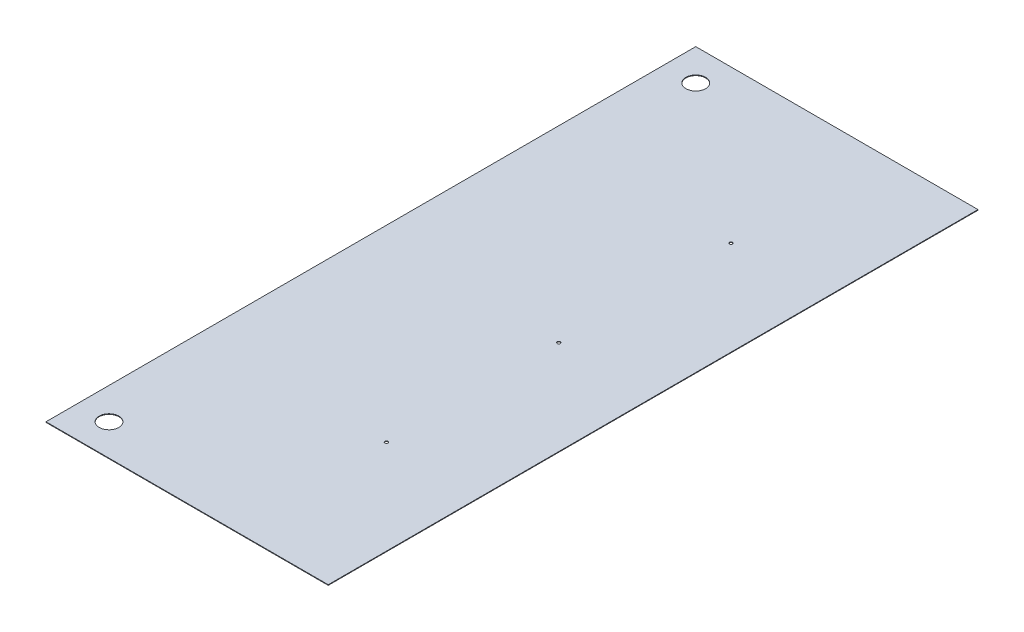
ISO-10303-21;
HEADER;
FILE_DESCRIPTION(('STEP AP214'),'2;1');
FILE_NAME('part.step','',(''),(''),'','','');
FILE_SCHEMA(('AUTOMOTIVE_DESIGN { 1 0 10303 214 1 1 1 1 }'));
ENDSEC;
DATA;
#1=APPLICATION_CONTEXT('core data for automotive mechanical design processes');
#2=APPLICATION_PROTOCOL_DEFINITION('international standard','automotive_design',2000,#1);
#3=PRODUCT_CONTEXT('',#1,'mechanical');
#4=PRODUCT('Part','Part','',(#3));
#5=PRODUCT_RELATED_PRODUCT_CATEGORY('part','',(#4));
#6=PRODUCT_DEFINITION_FORMATION('','',#4);
#7=PRODUCT_DEFINITION_CONTEXT('part definition',#1,'design');
#8=PRODUCT_DEFINITION('design','',#6,#7);
#9=PRODUCT_DEFINITION_SHAPE('','',#8);
#10=(LENGTH_UNIT() NAMED_UNIT(*) SI_UNIT(.MILLI.,.METRE.));
#11=(NAMED_UNIT(*) PLANE_ANGLE_UNIT() SI_UNIT($,.RADIAN.));
#12=(NAMED_UNIT(*) SI_UNIT($,.STERADIAN.) SOLID_ANGLE_UNIT());
#13=UNCERTAINTY_MEASURE_WITH_UNIT(LENGTH_MEASURE(1.E-05),#10,'distance_accuracy_value','');
#14=(GEOMETRIC_REPRESENTATION_CONTEXT(3) GLOBAL_UNCERTAINTY_ASSIGNED_CONTEXT((#13)) GLOBAL_UNIT_ASSIGNED_CONTEXT((#10,
#11,#12)) REPRESENTATION_CONTEXT('',''));
#15=CARTESIAN_POINT('',(0.,0.,0.));
#16=DIRECTION('',(0.,0.,1.));
#17=DIRECTION('',(1.,0.,0.));
#18=AXIS2_PLACEMENT_3D('',#15,#16,#17);
#19=CARTESIAN_POINT('',(0.,100.,0.));
#20=DIRECTION('',(0.,1.,0.));
#21=DIRECTION('',(0.,0.,1.));
#22=AXIS2_PLACEMENT_3D('',#19,#20,#21);
#23=PLANE('',#22);
#24=CARTESIAN_POINT('',(-1095.,100.,745.));
#25=DIRECTION('',(0.,1.,0.));
#26=DIRECTION('',(0.,0.,1.));
#27=AXIS2_PLACEMENT_3D('',#24,#25,#26);
#28=CIRCLE('',#27,25.);
#29=CARTESIAN_POINT('',(-1095.,100.,770.));
#30=VERTEX_POINT('',#29);
#31=EDGE_CURVE('E94',#30,#30,#28,.F.);
#32=ORIENTED_EDGE('',*,*,#31,.T.);
#33=EDGE_LOOP('',(#32));
#34=FACE_BOUND('',#33,.T.);
#35=CARTESIAN_POINT('',(-1095.,100.,-745.));
#36=DIRECTION('',(0.,1.,0.));
#37=DIRECTION('',(0.,0.,1.));
#38=AXIS2_PLACEMENT_3D('',#35,#36,#37);
#39=CIRCLE('',#38,25.);
#40=CARTESIAN_POINT('',(-1095.,100.,-720.));
#41=VERTEX_POINT('',#40);
#42=EDGE_CURVE('E97',#41,#41,#39,.F.);
#43=ORIENTED_EDGE('',*,*,#42,.T.);
#44=EDGE_LOOP('',(#43));
#45=FACE_BOUND('',#44,.T.);
#46=CARTESIAN_POINT('',(-698.,100.,-437.5));
#47=DIRECTION('',(0.,1.,0.));
#48=DIRECTION('',(0.,0.,1.));
#49=AXIS2_PLACEMENT_3D('',#46,#47,#48);
#50=CIRCLE('',#49,4.);
#51=CARTESIAN_POINT('',(-698.,100.,-433.5));
#52=VERTEX_POINT('',#51);
#53=EDGE_CURVE('E100',#52,#52,#50,.F.);
#54=ORIENTED_EDGE('',*,*,#53,.T.);
#55=EDGE_LOOP('',(#54));
#56=FACE_BOUND('',#55,.T.);
#57=CARTESIAN_POINT('',(-698.,100.,0.));
#58=DIRECTION('',(0.,1.,0.));
#59=DIRECTION('',(0.,0.,1.));
#60=AXIS2_PLACEMENT_3D('',#57,#58,#59);
#61=CIRCLE('',#60,3.99999999999999);
#62=CARTESIAN_POINT('',(-698.,100.,3.99999999999994));
#63=VERTEX_POINT('',#62);
#64=EDGE_CURVE('E102',#63,#63,#61,.F.);
#65=ORIENTED_EDGE('',*,*,#64,.T.);
#66=EDGE_LOOP('',(#65));
#67=FACE_BOUND('',#66,.T.);
#68=CARTESIAN_POINT('',(-698.,100.,437.5));
#69=DIRECTION('',(0.,1.,0.));
#70=DIRECTION('',(0.,0.,1.));
#71=AXIS2_PLACEMENT_3D('',#68,#69,#70);
#72=CIRCLE('',#71,4.);
#73=CARTESIAN_POINT('',(-698.,100.,441.5));
#74=VERTEX_POINT('',#73);
#75=EDGE_CURVE('E19',#74,#74,#72,.F.);
#76=ORIENTED_EDGE('',*,*,#75,.T.);
#77=EDGE_LOOP('',(#76));
#78=FACE_BOUND('',#77,.T.);
#79=DIRECTION('',(0.,0.,-1.));
#80=VECTOR('',#79,1.);
#81=CARTESIAN_POINT('',(-458.3,100.,-50.));
#82=LINE('',#81,#80);
#83=CARTESIAN_POINT('',(-458.3,100.,-825.));
#84=VERTEX_POINT('',#83);
#85=CARTESIAN_POINT('',(-458.3,100.,825.));
#86=VERTEX_POINT('',#85);
#87=EDGE_CURVE('E67',#84,#86,#82,.F.);
#88=ORIENTED_EDGE('',*,*,#87,.F.);
#89=DIRECTION('',(-1.,0.,0.));
#90=VECTOR('',#89,1.);
#91=CARTESIAN_POINT('',(-458.3,100.,-825.));
#92=LINE('',#91,#90);
#93=CARTESIAN_POINT('',(-1175.,100.,-825.));
#94=VERTEX_POINT('',#93);
#95=EDGE_CURVE('E58',#94,#84,#92,.F.);
#96=ORIENTED_EDGE('',*,*,#95,.F.);
#97=DIRECTION('',(0.,0.,1.));
#98=VECTOR('',#97,1.);
#99=CARTESIAN_POINT('',(-1175.,100.,40.));
#100=LINE('',#99,#98);
#101=CARTESIAN_POINT('',(-1175.,100.,825.));
#102=VERTEX_POINT('',#101);
#103=EDGE_CURVE('E53',#102,#94,#100,.F.);
#104=ORIENTED_EDGE('',*,*,#103,.F.);
#105=DIRECTION('',(1.,0.,0.));
#106=VECTOR('',#105,1.);
#107=CARTESIAN_POINT('',(-1175.,100.,825.));
#108=LINE('',#107,#106);
#109=EDGE_CURVE('E70',#86,#102,#108,.F.);
#110=ORIENTED_EDGE('',*,*,#109,.F.);
#111=EDGE_LOOP('',(#88,#96,#104,#110));
#112=FACE_BOUND('',#111,.T.);
#113=ADVANCED_FACE('F16',(#34,#45,#56,#67,#78,#112),#23,.T.);
#114=CARTESIAN_POINT('',(-458.3,98.5,-50.));
#115=DIRECTION('',(1.,0.,0.));
#116=DIRECTION('',(0.,0.,-1.));
#117=AXIS2_PLACEMENT_3D('',#114,#115,#116);
#118=PLANE('',#117);
#119=ORIENTED_EDGE('',*,*,#87,.T.);
#120=DIRECTION('',(0.,1.,0.));
#121=VECTOR('',#120,1.);
#122=CARTESIAN_POINT('',(-458.3,98.5,825.));
#123=LINE('',#122,#121);
#124=CARTESIAN_POINT('',(-458.3,98.5,825.));
#125=VERTEX_POINT('',#124);
#126=EDGE_CURVE('E110',#125,#86,#123,.T.);
#127=ORIENTED_EDGE('',*,*,#126,.F.);
#128=DIRECTION('',(0.,0.,1.));
#129=VECTOR('',#128,1.);
#130=CARTESIAN_POINT('',(-458.3,98.5,0.));
#131=LINE('',#130,#129);
#132=CARTESIAN_POINT('',(-458.3,98.5,-825.));
#133=VERTEX_POINT('',#132);
#134=EDGE_CURVE('E77',#125,#133,#131,.F.);
#135=ORIENTED_EDGE('',*,*,#134,.T.);
#136=DIRECTION('',(0.,1.,0.));
#137=VECTOR('',#136,1.);
#138=CARTESIAN_POINT('',(-458.3,98.5,-825.));
#139=LINE('',#138,#137);
#140=EDGE_CURVE('E63',#84,#133,#139,.F.);
#141=ORIENTED_EDGE('',*,*,#140,.F.);
#142=EDGE_LOOP('',(#119,#127,#135,#141));
#143=FACE_BOUND('',#142,.T.);
#144=ADVANCED_FACE('F76',(#143),#118,.T.);
#145=CARTESIAN_POINT('',(-458.3,98.5,-825.));
#146=DIRECTION('',(0.,0.,-1.));
#147=DIRECTION('',(-1.,0.,0.));
#148=AXIS2_PLACEMENT_3D('',#145,#146,#147);
#149=PLANE('',#148);
#150=ORIENTED_EDGE('',*,*,#95,.T.);
#151=ORIENTED_EDGE('',*,*,#140,.T.);
#152=DIRECTION('',(1.,0.,0.));
#153=VECTOR('',#152,1.);
#154=CARTESIAN_POINT('',(0.,98.5,-825.));
#155=LINE('',#154,#153);
#156=CARTESIAN_POINT('',(-1175.,98.5,-825.));
#157=VERTEX_POINT('',#156);
#158=EDGE_CURVE('E121',#133,#157,#155,.F.);
#159=ORIENTED_EDGE('',*,*,#158,.T.);
#160=DIRECTION('',(0.,1.,0.));
#161=VECTOR('',#160,1.);
#162=CARTESIAN_POINT('',(-1175.,98.5,-825.));
#163=LINE('',#162,#161);
#164=EDGE_CURVE('E65',#94,#157,#163,.F.);
#165=ORIENTED_EDGE('',*,*,#164,.F.);
#166=EDGE_LOOP('',(#150,#151,#159,#165));
#167=FACE_BOUND('',#166,.T.);
#168=ADVANCED_FACE('F60',(#167),#149,.T.);
#169=CARTESIAN_POINT('',(-1175.,98.5,40.));
#170=DIRECTION('',(-1.,0.,0.));
#171=DIRECTION('',(0.,0.,1.));
#172=AXIS2_PLACEMENT_3D('',#169,#170,#171);
#173=PLANE('',#172);
#174=ORIENTED_EDGE('',*,*,#103,.T.);
#175=ORIENTED_EDGE('',*,*,#164,.T.);
#176=DIRECTION('',(0.,0.,1.));
#177=VECTOR('',#176,1.);
#178=CARTESIAN_POINT('',(-1175.,98.5,0.));
#179=LINE('',#178,#177);
#180=CARTESIAN_POINT('',(-1175.,98.5,825.));
#181=VERTEX_POINT('',#180);
#182=EDGE_CURVE('E118',#157,#181,#179,.T.);
#183=ORIENTED_EDGE('',*,*,#182,.T.);
#184=DIRECTION('',(0.,1.,0.));
#185=VECTOR('',#184,1.);
#186=CARTESIAN_POINT('',(-1175.,98.5,825.));
#187=LINE('',#186,#185);
#188=EDGE_CURVE('E34',#102,#181,#187,.F.);
#189=ORIENTED_EDGE('',*,*,#188,.F.);
#190=EDGE_LOOP('',(#174,#175,#183,#189));
#191=FACE_BOUND('',#190,.T.);
#192=ADVANCED_FACE('F117',(#191),#173,.T.);
#193=CARTESIAN_POINT('',(-1175.,98.5,825.));
#194=DIRECTION('',(0.,0.,1.));
#195=DIRECTION('',(1.,0.,0.));
#196=AXIS2_PLACEMENT_3D('',#193,#194,#195);
#197=PLANE('',#196);
#198=ORIENTED_EDGE('',*,*,#109,.T.);
#199=ORIENTED_EDGE('',*,*,#188,.T.);
#200=DIRECTION('',(1.,0.,0.));
#201=VECTOR('',#200,1.);
#202=CARTESIAN_POINT('',(0.,98.5,825.));
#203=LINE('',#202,#201);
#204=EDGE_CURVE('E93',#181,#125,#203,.T.);
#205=ORIENTED_EDGE('',*,*,#204,.T.);
#206=ORIENTED_EDGE('',*,*,#126,.T.);
#207=EDGE_LOOP('',(#198,#199,#205,#206));
#208=FACE_BOUND('',#207,.T.);
#209=ADVANCED_FACE('F124',(#208),#197,.T.);
#210=CARTESIAN_POINT('',(-698.,98.5,437.5));
#211=DIRECTION('',(0.,1.,0.));
#212=DIRECTION('',(0.,0.,1.));
#213=AXIS2_PLACEMENT_3D('',#210,#211,#212);
#214=CYLINDRICAL_SURFACE('',#213,4.);
#215=ORIENTED_EDGE('',*,*,#75,.F.);
#216=EDGE_LOOP('',(#215));
#217=FACE_BOUND('',#216,.T.);
#218=CARTESIAN_POINT('',(-698.,98.5,437.5));
#219=DIRECTION('',(0.,1.,0.));
#220=DIRECTION('',(0.,0.,1.));
#221=AXIS2_PLACEMENT_3D('',#218,#219,#220);
#222=CIRCLE('',#221,4.);
#223=CARTESIAN_POINT('',(-698.,98.5,441.5));
#224=VERTEX_POINT('',#223);
#225=EDGE_CURVE('E90',#224,#224,#222,.F.);
#226=ORIENTED_EDGE('',*,*,#225,.T.);
#227=EDGE_LOOP('',(#226));
#228=FACE_BOUND('',#227,.T.);
#229=ADVANCED_FACE('F126',(#217,#228),#214,.F.);
#230=CARTESIAN_POINT('',(-698.,98.5,0.));
#231=DIRECTION('',(0.,1.,0.));
#232=DIRECTION('',(0.,0.,1.));
#233=AXIS2_PLACEMENT_3D('',#230,#231,#232);
#234=CYLINDRICAL_SURFACE('',#233,3.99999999999999);
#235=ORIENTED_EDGE('',*,*,#64,.F.);
#236=EDGE_LOOP('',(#235));
#237=FACE_BOUND('',#236,.T.);
#238=CARTESIAN_POINT('',(-698.,98.5,0.));
#239=DIRECTION('',(0.,1.,0.));
#240=DIRECTION('',(0.,0.,1.));
#241=AXIS2_PLACEMENT_3D('',#238,#239,#240);
#242=CIRCLE('',#241,3.99999999999999);
#243=CARTESIAN_POINT('',(-698.,98.5,3.99999999999994));
#244=VERTEX_POINT('',#243);
#245=EDGE_CURVE('E87',#244,#244,#242,.F.);
#246=ORIENTED_EDGE('',*,*,#245,.T.);
#247=EDGE_LOOP('',(#246));
#248=FACE_BOUND('',#247,.T.);
#249=ADVANCED_FACE('F133',(#237,#248),#234,.F.);
#250=CARTESIAN_POINT('',(-698.,98.5,-437.5));
#251=DIRECTION('',(0.,1.,0.));
#252=DIRECTION('',(0.,0.,1.));
#253=AXIS2_PLACEMENT_3D('',#250,#251,#252);
#254=CYLINDRICAL_SURFACE('',#253,4.);
#255=ORIENTED_EDGE('',*,*,#53,.F.);
#256=EDGE_LOOP('',(#255));
#257=FACE_BOUND('',#256,.T.);
#258=CARTESIAN_POINT('',(-698.,98.5,-437.5));
#259=DIRECTION('',(0.,1.,0.));
#260=DIRECTION('',(0.,0.,1.));
#261=AXIS2_PLACEMENT_3D('',#258,#259,#260);
#262=CIRCLE('',#261,4.);
#263=CARTESIAN_POINT('',(-698.,98.5,-433.5));
#264=VERTEX_POINT('',#263);
#265=EDGE_CURVE('E84',#264,#264,#262,.F.);
#266=ORIENTED_EDGE('',*,*,#265,.T.);
#267=EDGE_LOOP('',(#266));
#268=FACE_BOUND('',#267,.T.);
#269=ADVANCED_FACE('F152',(#257,#268),#254,.F.);
#270=CARTESIAN_POINT('',(-1095.,98.5,-745.));
#271=DIRECTION('',(0.,1.,0.));
#272=DIRECTION('',(0.,0.,1.));
#273=AXIS2_PLACEMENT_3D('',#270,#271,#272);
#274=CYLINDRICAL_SURFACE('',#273,25.);
#275=ORIENTED_EDGE('',*,*,#42,.F.);
#276=EDGE_LOOP('',(#275));
#277=FACE_BOUND('',#276,.T.);
#278=CARTESIAN_POINT('',(-1095.,98.5,-745.));
#279=DIRECTION('',(0.,1.,0.));
#280=DIRECTION('',(0.,0.,1.));
#281=AXIS2_PLACEMENT_3D('',#278,#279,#280);
#282=CIRCLE('',#281,25.);
#283=CARTESIAN_POINT('',(-1095.,98.5,-720.));
#284=VERTEX_POINT('',#283);
#285=EDGE_CURVE('E25',#284,#284,#282,.F.);
#286=ORIENTED_EDGE('',*,*,#285,.T.);
#287=EDGE_LOOP('',(#286));
#288=FACE_BOUND('',#287,.T.);
#289=ADVANCED_FACE('F144',(#277,#288),#274,.F.);
#290=CARTESIAN_POINT('',(-1095.,98.5,745.));
#291=DIRECTION('',(0.,1.,0.));
#292=DIRECTION('',(0.,0.,1.));
#293=AXIS2_PLACEMENT_3D('',#290,#291,#292);
#294=CYLINDRICAL_SURFACE('',#293,25.);
#295=ORIENTED_EDGE('',*,*,#31,.F.);
#296=EDGE_LOOP('',(#295));
#297=FACE_BOUND('',#296,.T.);
#298=CARTESIAN_POINT('',(-1095.,98.5,745.));
#299=DIRECTION('',(0.,1.,0.));
#300=DIRECTION('',(0.,0.,1.));
#301=AXIS2_PLACEMENT_3D('',#298,#299,#300);
#302=CIRCLE('',#301,25.);
#303=CARTESIAN_POINT('',(-1095.,98.5,770.));
#304=VERTEX_POINT('',#303);
#305=EDGE_CURVE('E11',#304,#304,#302,.F.);
#306=ORIENTED_EDGE('',*,*,#305,.T.);
#307=EDGE_LOOP('',(#306));
#308=FACE_BOUND('',#307,.T.);
#309=ADVANCED_FACE('F138',(#297,#308),#294,.F.);
#310=CARTESIAN_POINT('',(0.,98.5,0.));
#311=DIRECTION('',(0.,1.,0.));
#312=DIRECTION('',(0.,0.,1.));
#313=AXIS2_PLACEMENT_3D('',#310,#311,#312);
#314=PLANE('',#313);
#315=ORIENTED_EDGE('',*,*,#305,.F.);
#316=EDGE_LOOP('',(#315));
#317=FACE_BOUND('',#316,.T.);
#318=ORIENTED_EDGE('',*,*,#285,.F.);
#319=EDGE_LOOP('',(#318));
#320=FACE_BOUND('',#319,.T.);
#321=ORIENTED_EDGE('',*,*,#265,.F.);
#322=EDGE_LOOP('',(#321));
#323=FACE_BOUND('',#322,.T.);
#324=ORIENTED_EDGE('',*,*,#245,.F.);
#325=EDGE_LOOP('',(#324));
#326=FACE_BOUND('',#325,.T.);
#327=ORIENTED_EDGE('',*,*,#225,.F.);
#328=EDGE_LOOP('',(#327));
#329=FACE_BOUND('',#328,.T.);
#330=ORIENTED_EDGE('',*,*,#182,.F.);
#331=ORIENTED_EDGE('',*,*,#158,.F.);
#332=ORIENTED_EDGE('',*,*,#134,.F.);
#333=ORIENTED_EDGE('',*,*,#204,.F.);
#334=EDGE_LOOP('',(#330,#331,#332,#333));
#335=FACE_BOUND('',#334,.T.);
#336=ADVANCED_FACE('F120',(#317,#320,#323,#326,#329,#335),#314,.F.);
#337=CLOSED_SHELL('',(#113,#144,#168,#192,#209,#229,#249,#269,#289,#309,#336));
#338=MANIFOLD_SOLID_BREP('B1',#337);
#339=ADVANCED_BREP_SHAPE_REPRESENTATION('',(#18,#338),#14);
#340=SHAPE_DEFINITION_REPRESENTATION(#9,#339);
ENDSEC;
END-ISO-10303-21;
